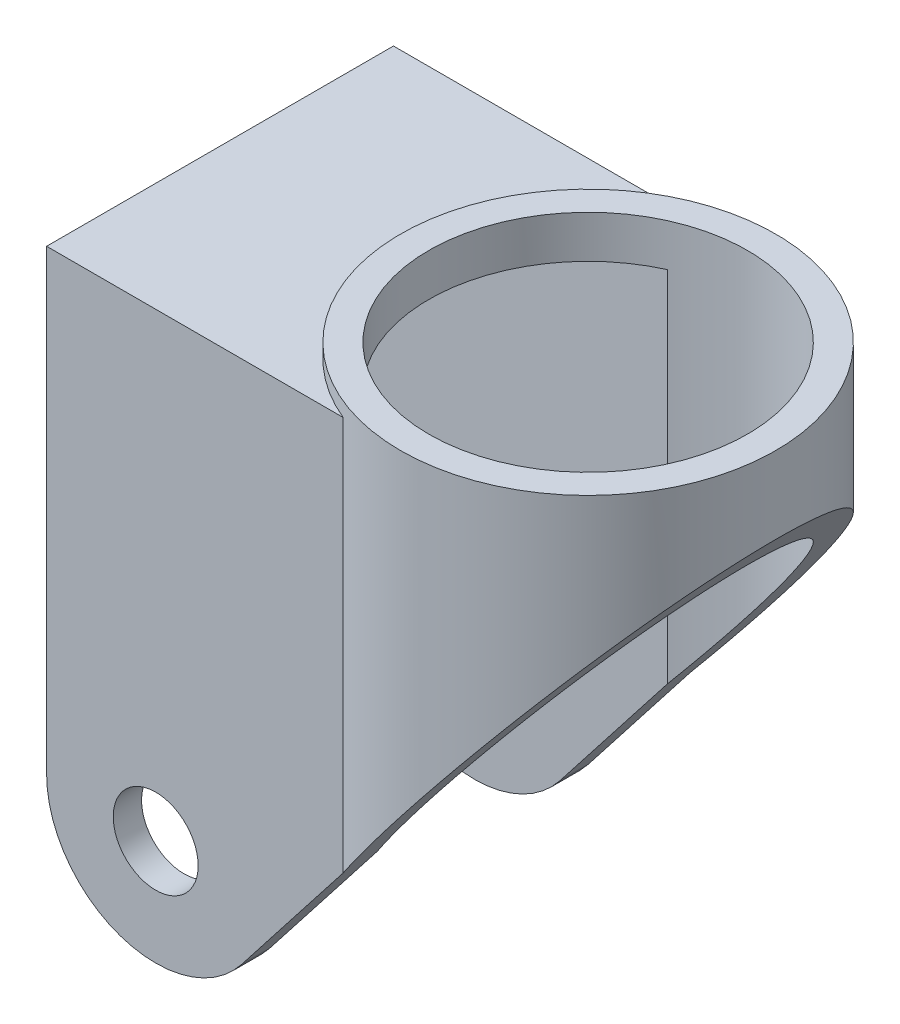
ISO-10303-21;
HEADER;
FILE_DESCRIPTION(('STEP AP214'),'2;1');
FILE_NAME('part.step','',(''),(''),'','','');
FILE_SCHEMA(('AUTOMOTIVE_DESIGN { 1 0 10303 214 1 1 1 1 }'));
ENDSEC;
DATA;
#1=APPLICATION_CONTEXT('core data for automotive mechanical design processes');
#2=APPLICATION_PROTOCOL_DEFINITION('international standard','automotive_design',2000,#1);
#3=PRODUCT_CONTEXT('',#1,'mechanical');
#4=PRODUCT('Part','Part','',(#3));
#5=PRODUCT_RELATED_PRODUCT_CATEGORY('part','',(#4));
#6=PRODUCT_DEFINITION_FORMATION('','',#4);
#7=PRODUCT_DEFINITION_CONTEXT('part definition',#1,'design');
#8=PRODUCT_DEFINITION('design','',#6,#7);
#9=PRODUCT_DEFINITION_SHAPE('','',#8);
#10=(LENGTH_UNIT() NAMED_UNIT(*) SI_UNIT(.MILLI.,.METRE.));
#11=(NAMED_UNIT(*) PLANE_ANGLE_UNIT() SI_UNIT($,.RADIAN.));
#12=(NAMED_UNIT(*) SI_UNIT($,.STERADIAN.) SOLID_ANGLE_UNIT());
#13=UNCERTAINTY_MEASURE_WITH_UNIT(LENGTH_MEASURE(1.E-05),#10,'distance_accuracy_value','');
#14=(GEOMETRIC_REPRESENTATION_CONTEXT(3) GLOBAL_UNCERTAINTY_ASSIGNED_CONTEXT((#13)) GLOBAL_UNIT_ASSIGNED_CONTEXT((#10,
#11,#12)) REPRESENTATION_CONTEXT('',''));
#15=CARTESIAN_POINT('',(0.,0.,0.));
#16=DIRECTION('',(0.,0.,1.));
#17=DIRECTION('',(1.,0.,0.));
#18=AXIS2_PLACEMENT_3D('',#15,#16,#17);
#19=CARTESIAN_POINT('',(-36.5900385910955,15.4099614089045,20.5));
#20=DIRECTION('',(0.,0.,1.));
#21=DIRECTION('',(1.,0.,0.));
#22=AXIS2_PLACEMENT_3D('',#19,#20,#21);
#23=CYLINDRICAL_SURFACE('',#22,15.4099614089045);
#24=DIRECTION('',(0.,0.,1.));
#25=VECTOR('',#24,1.);
#26=CARTESIAN_POINT('',(-52.,15.4099614089045,24.5));
#27=LINE('',#26,#25);
#28=CARTESIAN_POINT('',(-52.,15.4099614089045,20.5));
#29=VERTEX_POINT('',#28);
#30=CARTESIAN_POINT('',(-52.,15.4099614089045,24.5));
#31=VERTEX_POINT('',#30);
#32=EDGE_CURVE('E206',#29,#31,#27,.T.);
#33=ORIENTED_EDGE('',*,*,#32,.F.);
#34=CARTESIAN_POINT('',(-36.5900385910955,15.4099614089045,20.4999999999968));
#35=DIRECTION('',(-2.10034980860577E-13,0.,-1.));
#36=DIRECTION('',(-1.,0.,2.10034980860577E-13));
#37=AXIS2_PLACEMENT_3D('',#34,#35,#36);
#38=CIRCLE('',#37,15.4099614089045);
#39=CARTESIAN_POINT('',(-24.4468232882142,5.92264183318687,20.4999999999942));
#40=VERTEX_POINT('',#39);
#41=EDGE_CURVE('E53',#40,#29,#38,.T.);
#42=ORIENTED_EDGE('',*,*,#41,.F.);
#43=DIRECTION('',(0.,0.,-1.));
#44=VECTOR('',#43,1.);
#45=CARTESIAN_POINT('',(-24.4468232882142,5.92264183318687,20.5));
#46=LINE('',#45,#44);
#47=CARTESIAN_POINT('',(-24.4468232882142,5.92264183318687,24.4999999999942));
#48=VERTEX_POINT('',#47);
#49=EDGE_CURVE('E209',#48,#40,#46,.T.);
#50=ORIENTED_EDGE('',*,*,#49,.F.);
#51=CARTESIAN_POINT('',(-36.5900385910955,15.4099614089045,24.4999999999968));
#52=DIRECTION('',(-2.10034980860577E-13,0.,-1.));
#53=DIRECTION('',(-1.,0.,2.10034980860577E-13));
#54=AXIS2_PLACEMENT_3D('',#51,#52,#53);
#55=CIRCLE('',#54,15.4099614089045);
#56=EDGE_CURVE('E12',#31,#48,#55,.F.);
#57=ORIENTED_EDGE('',*,*,#56,.F.);
#58=EDGE_LOOP('',(#33,#42,#50,#57));
#59=FACE_BOUND('',#58,.T.);
#60=ADVANCED_FACE('F44',(#59),#23,.T.);
#61=CARTESIAN_POINT('',(-36.5900385910955,15.4099614089045,-20.5000000000109));
#62=DIRECTION('',(0.,0.,-1.));
#63=DIRECTION('',(-1.,0.,0.));
#64=AXIS2_PLACEMENT_3D('',#61,#62,#63);
#65=CYLINDRICAL_SURFACE('',#64,15.4099614089045);
#66=DIRECTION('',(0.,0.,1.));
#67=VECTOR('',#66,1.);
#68=CARTESIAN_POINT('',(-24.4468232882142,5.92264183318688,-20.5000000000109));
#69=LINE('',#68,#67);
#70=CARTESIAN_POINT('',(-24.4468232882142,5.92264183318687,-20.5000000000109));
#71=VERTEX_POINT('',#70);
#72=CARTESIAN_POINT('',(-24.4468232882142,5.92264183318687,-24.5000000000109));
#73=VERTEX_POINT('',#72);
#74=EDGE_CURVE('E130',#71,#73,#69,.F.);
#75=ORIENTED_EDGE('',*,*,#74,.F.);
#76=CARTESIAN_POINT('',(-36.5900385910955,15.4099614089045,-20.5000000000109));
#77=DIRECTION('',(0.,0.,1.));
#78=DIRECTION('',(1.,0.,0.));
#79=AXIS2_PLACEMENT_3D('',#76,#77,#78);
#80=CIRCLE('',#79,15.4099614089045);
#81=CARTESIAN_POINT('',(-52.,15.4099614089045,-20.5000000000109));
#82=VERTEX_POINT('',#81);
#83=EDGE_CURVE('E202',#82,#71,#80,.T.);
#84=ORIENTED_EDGE('',*,*,#83,.F.);
#85=DIRECTION('',(0.,0.,-1.));
#86=VECTOR('',#85,1.);
#87=CARTESIAN_POINT('',(-52.,15.4099614089045,24.5));
#88=LINE('',#87,#86);
#89=CARTESIAN_POINT('',(-52.,15.4099614089045,-24.5000000000109));
#90=VERTEX_POINT('',#89);
#91=EDGE_CURVE('E199',#90,#82,#88,.F.);
#92=ORIENTED_EDGE('',*,*,#91,.F.);
#93=CARTESIAN_POINT('',(-36.5900385910955,15.4099614089045,-24.5000000000109));
#94=DIRECTION('',(0.,0.,1.));
#95=DIRECTION('',(1.,0.,0.));
#96=AXIS2_PLACEMENT_3D('',#93,#94,#95);
#97=CIRCLE('',#96,15.4099614089045);
#98=EDGE_CURVE('E204',#73,#90,#97,.F.);
#99=ORIENTED_EDGE('',*,*,#98,.F.);
#100=EDGE_LOOP('',(#75,#84,#92,#99));
#101=FACE_BOUND('',#100,.T.);
#102=ADVANCED_FACE('F238',(#101),#65,.T.);
#103=CARTESIAN_POINT('',(0.,82.,0.));
#104=DIRECTION('',(0.,-1.,0.));
#105=DIRECTION('',(0.,0.,-1.));
#106=AXIS2_PLACEMENT_3D('',#103,#104,#105);
#107=CYLINDRICAL_SURFACE('',#106,22.5);
#108=DIRECTION('',(0.,-1.,0.));
#109=VECTOR('',#108,1.);
#110=CARTESIAN_POINT('',(-9.2736184954716,76.,-20.5000000000109));
#111=LINE('',#110,#109);
#112=CARTESIAN_POINT('',(-9.2736184954716,76.,-20.5000000000109));
#113=VERTEX_POINT('',#112);
#114=CARTESIAN_POINT('',(-9.2736184954716,25.3434583412096,-20.5000000000109));
#115=VERTEX_POINT('',#114);
#116=EDGE_CURVE('E147',#113,#115,#111,.T.);
#117=ORIENTED_EDGE('',*,*,#116,.T.);
#118=CARTESIAN_POINT('',(0.,37.2131487346395,0.));
#119=DIRECTION('',(0.788010753606721,-0.615661475325659,0.));
#120=DIRECTION('',(-0.615661475325659,-0.788010753606721,0.));
#121=AXIS2_PLACEMENT_3D('',#118,#119,#120);
#122=ELLIPSE('',#121,36.5460580233617,22.5);
#123=CARTESIAN_POINT('',(-9.27361849551552,25.3434583411534,20.499999999991));
#124=VERTEX_POINT('',#123);
#125=EDGE_CURVE('E146',#115,#124,#122,.T.);
#126=ORIENTED_EDGE('',*,*,#125,.T.);
#127=DIRECTION('',(0.,-1.,0.));
#128=VECTOR('',#127,1.);
#129=CARTESIAN_POINT('',(-9.27361849551552,25.3434583411534,20.499999999991));
#130=LINE('',#129,#128);
#131=CARTESIAN_POINT('',(-9.27361849551553,76.,20.499999999991));
#132=VERTEX_POINT('',#131);
#133=EDGE_CURVE('E137',#124,#132,#130,.F.);
#134=ORIENTED_EDGE('',*,*,#133,.T.);
#135=CARTESIAN_POINT('',(0.,76.,0.));
#136=DIRECTION('',(0.,-1.,0.));
#137=DIRECTION('',(0.,0.,-1.));
#138=AXIS2_PLACEMENT_3D('',#135,#136,#137);
#139=CIRCLE('',#138,22.5);
#140=EDGE_CURVE('E119',#132,#113,#139,.T.);
#141=ORIENTED_EDGE('',*,*,#140,.T.);
#142=EDGE_LOOP('',(#117,#126,#134,#141));
#143=FACE_BOUND('',#142,.T.);
#144=CARTESIAN_POINT('',(0.,82.,0.));
#145=DIRECTION('',(0.,1.,0.));
#146=DIRECTION('',(0.,0.,1.));
#147=AXIS2_PLACEMENT_3D('',#144,#145,#146);
#148=CIRCLE('',#147,22.5);
#149=CARTESIAN_POINT('',(0.,82.,22.5));
#150=VERTEX_POINT('',#149);
#151=EDGE_CURVE('E189',#150,#150,#148,.T.);
#152=ORIENTED_EDGE('',*,*,#151,.T.);
#153=EDGE_LOOP('',(#152));
#154=FACE_BOUND('',#153,.T.);
#155=ADVANCED_FACE('F143',(#143,#154),#107,.F.);
#156=CARTESIAN_POINT('',(0.,82.,0.));
#157=DIRECTION('',(0.,-1.,0.));
#158=DIRECTION('',(0.,0.,-1.));
#159=AXIS2_PLACEMENT_3D('',#156,#157,#158);
#160=CYLINDRICAL_SURFACE('',#159,26.5);
#161=CARTESIAN_POINT('',(0.,82.,0.));
#162=DIRECTION('',(0.,1.,0.));
#163=DIRECTION('',(0.,0.,1.));
#164=AXIS2_PLACEMENT_3D('',#161,#162,#163);
#165=CIRCLE('',#164,26.5);
#166=CARTESIAN_POINT('',(0.,82.,26.5));
#167=VERTEX_POINT('',#166);
#168=EDGE_CURVE('E192',#167,#167,#165,.T.);
#169=ORIENTED_EDGE('',*,*,#168,.F.);
#170=EDGE_LOOP('',(#169));
#171=FACE_BOUND('',#170,.T.);
#172=CARTESIAN_POINT('',(0.,37.2131487346395,0.));
#173=DIRECTION('',(0.788010753606721,-0.615661475325659,0.));
#174=DIRECTION('',(-0.615661475325659,-0.788010753606721,0.));
#175=AXIS2_PLACEMENT_3D('',#172,#173,#174);
#176=ELLIPSE('',#175,43.0431350052927,26.5);
#177=CARTESIAN_POINT('',(-10.0995049383356,24.2863718995241,-24.5000000000109));
#178=VERTEX_POINT('',#177);
#179=CARTESIAN_POINT('',(-10.0995049383834,24.286371899463,24.4999999999912));
#180=VERTEX_POINT('',#179);
#181=EDGE_CURVE('E166',#178,#180,#176,.T.);
#182=ORIENTED_EDGE('',*,*,#181,.F.);
#183=DIRECTION('',(0.,-1.,0.));
#184=VECTOR('',#183,1.);
#185=CARTESIAN_POINT('',(-10.0995049383356,82.,-24.5000000000109));
#186=LINE('',#185,#184);
#187=CARTESIAN_POINT('',(-10.0995049383356,80.,-24.5000000000109));
#188=VERTEX_POINT('',#187);
#189=EDGE_CURVE('E186',#188,#178,#186,.T.);
#190=ORIENTED_EDGE('',*,*,#189,.F.);
#191=CARTESIAN_POINT('',(0.,80.,0.));
#192=DIRECTION('',(0.,-1.,0.));
#193=DIRECTION('',(0.,0.,-1.));
#194=AXIS2_PLACEMENT_3D('',#191,#192,#193);
#195=CIRCLE('',#194,26.5);
#196=CARTESIAN_POINT('',(-10.0995049383834,80.,24.4999999999912));
#197=VERTEX_POINT('',#196);
#198=EDGE_CURVE('E131',#197,#188,#195,.T.);
#199=ORIENTED_EDGE('',*,*,#198,.F.);
#200=DIRECTION('',(0.,-1.,0.));
#201=VECTOR('',#200,1.);
#202=CARTESIAN_POINT('',(-10.0995049383834,82.,24.4999999999912));
#203=LINE('',#202,#201);
#204=EDGE_CURVE('E184',#180,#197,#203,.F.);
#205=ORIENTED_EDGE('',*,*,#204,.F.);
#206=EDGE_LOOP('',(#182,#190,#199,#205));
#207=FACE_BOUND('',#206,.T.);
#208=ADVANCED_FACE('F228',(#171,#207),#160,.T.);
#209=CARTESIAN_POINT('',(0.,80.,24.4999999999891));
#210=DIRECTION('',(-2.10034980860577E-13,0.,-1.));
#211=DIRECTION('',(-1.,0.,2.10034980860577E-13));
#212=AXIS2_PLACEMENT_3D('',#209,#210,#211);
#213=PLANE('',#212);
#214=CARTESIAN_POINT('',(-36.5900385910954,14.9244773027306,24.4999999999891));
#215=DIRECTION('',(0.,0.,1.));
#216=DIRECTION('',(1.,0.,0.));
#217=AXIS2_PLACEMENT_3D('',#214,#215,#216);
#218=CIRCLE('',#217,5.99999999999999);
#219=CARTESIAN_POINT('',(-30.5900385910954,14.9244773027306,24.4999999999891));
#220=VERTEX_POINT('',#219);
#221=EDGE_CURVE('E293',#220,#220,#218,.T.);
#222=ORIENTED_EDGE('',*,*,#221,.F.);
#223=EDGE_LOOP('',(#222));
#224=FACE_BOUND('',#223,.T.);
#225=DIRECTION('',(0.,-1.,0.));
#226=VECTOR('',#225,1.);
#227=CARTESIAN_POINT('',(-52.,80.,24.5));
#228=LINE('',#227,#226);
#229=CARTESIAN_POINT('',(-52.,80.,24.5));
#230=VERTEX_POINT('',#229);
#231=EDGE_CURVE('E179',#230,#31,#228,.T.);
#232=ORIENTED_EDGE('',*,*,#231,.T.);
#233=ORIENTED_EDGE('',*,*,#56,.T.);
#234=DIRECTION('',(-0.615661475325659,-0.788010753606721,1.29310446186619E-13));
#235=VECTOR('',#234,1.);
#236=CARTESIAN_POINT('',(20.757949461793,63.7821124497482,24.4999999999847));
#237=LINE('',#236,#235);
#238=EDGE_CURVE('E169',#180,#48,#237,.T.);
#239=ORIENTED_EDGE('',*,*,#238,.F.);
#240=ORIENTED_EDGE('',*,*,#204,.T.);
#241=DIRECTION('',(1.,0.,-2.10034980860576E-13));
#242=VECTOR('',#241,1.);
#243=CARTESIAN_POINT('',(0.,80.,24.4999999999891));
#244=LINE('',#243,#242);
#245=EDGE_CURVE('E176',#230,#197,#244,.T.);
#246=ORIENTED_EDGE('',*,*,#245,.F.);
#247=EDGE_LOOP('',(#232,#233,#239,#240,#246));
#248=FACE_BOUND('',#247,.T.);
#249=ADVANCED_FACE('F224',(#224,#248),#213,.F.);
#250=CARTESIAN_POINT('',(-52.,80.,-24.5000000000109));
#251=DIRECTION('',(0.,0.,1.));
#252=DIRECTION('',(1.,0.,0.));
#253=AXIS2_PLACEMENT_3D('',#250,#251,#252);
#254=PLANE('',#253);
#255=CARTESIAN_POINT('',(-36.5900385910954,14.9244773027306,-24.5000000000109));
#256=DIRECTION('',(0.,0.,1.));
#257=DIRECTION('',(1.,0.,0.));
#258=AXIS2_PLACEMENT_3D('',#255,#256,#257);
#259=CIRCLE('',#258,5.99999999999999);
#260=CARTESIAN_POINT('',(-30.5900385910954,14.9244773027306,-24.5000000000109));
#261=VERTEX_POINT('',#260);
#262=EDGE_CURVE('E162',#261,#261,#259,.T.);
#263=ORIENTED_EDGE('',*,*,#262,.T.);
#264=EDGE_LOOP('',(#263));
#265=FACE_BOUND('',#264,.T.);
#266=DIRECTION('',(0.615661475325659,0.788010753606721,0.));
#267=VECTOR('',#266,1.);
#268=CARTESIAN_POINT('',(1.04791874738434,38.5544235665723,-24.5000000000109));
#269=LINE('',#268,#267);
#270=EDGE_CURVE('E164',#73,#178,#269,.T.);
#271=ORIENTED_EDGE('',*,*,#270,.F.);
#272=ORIENTED_EDGE('',*,*,#98,.T.);
#273=DIRECTION('',(0.,-1.,0.));
#274=VECTOR('',#273,1.);
#275=CARTESIAN_POINT('',(-52.,80.,-24.5000000000109));
#276=LINE('',#275,#274);
#277=CARTESIAN_POINT('',(-52.,80.,-24.5000000000109));
#278=VERTEX_POINT('',#277);
#279=EDGE_CURVE('E181',#278,#90,#276,.T.);
#280=ORIENTED_EDGE('',*,*,#279,.F.);
#281=DIRECTION('',(-1.,0.,0.));
#282=VECTOR('',#281,1.);
#283=CARTESIAN_POINT('',(-52.,80.,-24.5000000000109));
#284=LINE('',#283,#282);
#285=EDGE_CURVE('E172',#188,#278,#284,.T.);
#286=ORIENTED_EDGE('',*,*,#285,.F.);
#287=ORIENTED_EDGE('',*,*,#189,.T.);
#288=EDGE_LOOP('',(#271,#272,#280,#286,#287));
#289=FACE_BOUND('',#288,.T.);
#290=ADVANCED_FACE('F236',(#265,#289),#254,.F.);
#291=CARTESIAN_POINT('',(0.,82.,0.));
#292=DIRECTION('',(0.,1.,0.));
#293=DIRECTION('',(0.,0.,1.));
#294=AXIS2_PLACEMENT_3D('',#291,#292,#293);
#295=PLANE('',#294);
#296=ORIENTED_EDGE('',*,*,#151,.F.);
#297=EDGE_LOOP('',(#296));
#298=FACE_BOUND('',#297,.T.);
#299=ORIENTED_EDGE('',*,*,#168,.T.);
#300=EDGE_LOOP('',(#299));
#301=FACE_BOUND('',#300,.T.);
#302=ADVANCED_FACE('F252',(#298,#301),#295,.T.);
#303=CARTESIAN_POINT('',(0.,80.,0.));
#304=DIRECTION('',(0.,-1.,0.));
#305=DIRECTION('',(0.,0.,-1.));
#306=AXIS2_PLACEMENT_3D('',#303,#304,#305);
#307=PLANE('',#306);
#308=ORIENTED_EDGE('',*,*,#245,.T.);
#309=ORIENTED_EDGE('',*,*,#198,.T.);
#310=ORIENTED_EDGE('',*,*,#285,.T.);
#311=DIRECTION('',(0.,0.,1.));
#312=VECTOR('',#311,1.);
#313=CARTESIAN_POINT('',(-52.,80.,24.5));
#314=LINE('',#313,#312);
#315=EDGE_CURVE('E174',#278,#230,#314,.T.);
#316=ORIENTED_EDGE('',*,*,#315,.T.);
#317=EDGE_LOOP('',(#308,#309,#310,#316));
#318=FACE_BOUND('',#317,.T.);
#319=ADVANCED_FACE('F231',(#318),#307,.F.);
#320=CARTESIAN_POINT('',(-52.,80.,24.5));
#321=DIRECTION('',(1.,0.,0.));
#322=DIRECTION('',(0.,0.,-1.));
#323=AXIS2_PLACEMENT_3D('',#320,#321,#322);
#324=PLANE('',#323);
#325=DIRECTION('',(0.,-1.,0.));
#326=VECTOR('',#325,1.);
#327=CARTESIAN_POINT('',(-52.,80.,20.5));
#328=LINE('',#327,#326);
#329=CARTESIAN_POINT('',(-52.,76.,20.5));
#330=VERTEX_POINT('',#329);
#331=EDGE_CURVE('E140',#330,#29,#328,.T.);
#332=ORIENTED_EDGE('',*,*,#331,.T.);
#333=ORIENTED_EDGE('',*,*,#32,.T.);
#334=ORIENTED_EDGE('',*,*,#231,.F.);
#335=ORIENTED_EDGE('',*,*,#315,.F.);
#336=ORIENTED_EDGE('',*,*,#279,.T.);
#337=ORIENTED_EDGE('',*,*,#91,.T.);
#338=DIRECTION('',(0.,-1.,0.));
#339=VECTOR('',#338,1.);
#340=CARTESIAN_POINT('',(-52.,80.,-20.5000000000109));
#341=LINE('',#340,#339);
#342=CARTESIAN_POINT('',(-52.,76.,-20.5000000000109));
#343=VERTEX_POINT('',#342);
#344=EDGE_CURVE('E148',#343,#82,#341,.T.);
#345=ORIENTED_EDGE('',*,*,#344,.F.);
#346=DIRECTION('',(0.,0.,1.));
#347=VECTOR('',#346,1.);
#348=CARTESIAN_POINT('',(-52.,76.,0.));
#349=LINE('',#348,#347);
#350=EDGE_CURVE('E141',#343,#330,#349,.T.);
#351=ORIENTED_EDGE('',*,*,#350,.T.);
#352=EDGE_LOOP('',(#332,#333,#334,#335,#336,#337,#345,#351));
#353=FACE_BOUND('',#352,.T.);
#354=ADVANCED_FACE('F213',(#353),#324,.F.);
#355=CARTESIAN_POINT('',(26.5,71.131601987756,184.725856080036));
#356=DIRECTION('',(0.788010753606721,-0.615661475325659,0.));
#357=DIRECTION('',(0.615661475325659,0.788010753606721,0.));
#358=AXIS2_PLACEMENT_3D('',#355,#356,#357);
#359=PLANE('',#358);
#360=ORIENTED_EDGE('',*,*,#238,.T.);
#361=ORIENTED_EDGE('',*,*,#49,.T.);
#362=DIRECTION('',(-0.615661475325659,-0.788010753606721,1.29310446186619E-13));
#363=VECTOR('',#362,1.);
#364=CARTESIAN_POINT('',(20.7579494617927,63.7821124497478,20.4999999999847));
#365=LINE('',#364,#363);
#366=EDGE_CURVE('E156',#124,#40,#365,.T.);
#367=ORIENTED_EDGE('',*,*,#366,.F.);
#368=ORIENTED_EDGE('',*,*,#125,.F.);
#369=DIRECTION('',(0.615661475325659,0.788010753606721,0.));
#370=VECTOR('',#369,1.);
#371=CARTESIAN_POINT('',(1.04791874738434,38.5544235665723,-20.5000000000109));
#372=LINE('',#371,#370);
#373=EDGE_CURVE('E158',#71,#115,#372,.T.);
#374=ORIENTED_EDGE('',*,*,#373,.F.);
#375=ORIENTED_EDGE('',*,*,#74,.T.);
#376=ORIENTED_EDGE('',*,*,#270,.T.);
#377=ORIENTED_EDGE('',*,*,#181,.T.);
#378=EDGE_LOOP('',(#360,#361,#367,#368,#374,#375,#376,#377));
#379=FACE_BOUND('',#378,.T.);
#380=ADVANCED_FACE('F221',(#379),#359,.T.);
#381=CARTESIAN_POINT('',(-8.40139923442306E-13,80.,20.4999999999891));
#382=DIRECTION('',(-2.10034980860577E-13,0.,-1.));
#383=DIRECTION('',(-1.,0.,2.10034980860577E-13));
#384=AXIS2_PLACEMENT_3D('',#381,#382,#383);
#385=PLANE('',#384);
#386=CARTESIAN_POINT('',(-36.5900385910954,14.9244773027306,20.4999999999968));
#387=DIRECTION('',(-2.10034980860577E-13,0.,-1.));
#388=DIRECTION('',(-1.,0.,2.10034980860577E-13));
#389=AXIS2_PLACEMENT_3D('',#386,#387,#388);
#390=CIRCLE('',#389,5.99999999999999);
#391=CARTESIAN_POINT('',(-42.5900385910954,14.9244773027306,20.499999999998));
#392=VERTEX_POINT('',#391);
#393=EDGE_CURVE('E289',#392,#392,#390,.T.);
#394=ORIENTED_EDGE('',*,*,#393,.F.);
#395=EDGE_LOOP('',(#394));
#396=FACE_BOUND('',#395,.T.);
#397=ORIENTED_EDGE('',*,*,#366,.T.);
#398=ORIENTED_EDGE('',*,*,#41,.T.);
#399=ORIENTED_EDGE('',*,*,#331,.F.);
#400=DIRECTION('',(1.,0.,-2.10034980860577E-13));
#401=VECTOR('',#400,1.);
#402=CARTESIAN_POINT('',(4.30571710763953E-12,76.,20.4999999999891));
#403=LINE('',#402,#401);
#404=EDGE_CURVE('E123',#330,#132,#403,.T.);
#405=ORIENTED_EDGE('',*,*,#404,.T.);
#406=ORIENTED_EDGE('',*,*,#133,.F.);
#407=EDGE_LOOP('',(#397,#398,#399,#405,#406));
#408=FACE_BOUND('',#407,.T.);
#409=ADVANCED_FACE('F136',(#396,#408),#385,.T.);
#410=CARTESIAN_POINT('',(-52.,80.,-20.5000000000109));
#411=DIRECTION('',(0.,0.,1.));
#412=DIRECTION('',(1.,0.,0.));
#413=AXIS2_PLACEMENT_3D('',#410,#411,#412);
#414=PLANE('',#413);
#415=CARTESIAN_POINT('',(-36.5900385910954,14.9244773027306,-20.5000000000109));
#416=DIRECTION('',(0.,0.,1.));
#417=DIRECTION('',(1.,0.,0.));
#418=AXIS2_PLACEMENT_3D('',#415,#416,#417);
#419=CIRCLE('',#418,5.99999999999999);
#420=CARTESIAN_POINT('',(-30.5900385910954,14.9244773027306,-20.5000000000109));
#421=VERTEX_POINT('',#420);
#422=EDGE_CURVE('E48',#421,#421,#419,.T.);
#423=ORIENTED_EDGE('',*,*,#422,.F.);
#424=EDGE_LOOP('',(#423));
#425=FACE_BOUND('',#424,.T.);
#426=ORIENTED_EDGE('',*,*,#344,.T.);
#427=ORIENTED_EDGE('',*,*,#83,.T.);
#428=ORIENTED_EDGE('',*,*,#373,.T.);
#429=ORIENTED_EDGE('',*,*,#116,.F.);
#430=DIRECTION('',(-1.,0.,0.));
#431=VECTOR('',#430,1.);
#432=CARTESIAN_POINT('',(0.,76.,-20.5000000000109));
#433=LINE('',#432,#431);
#434=EDGE_CURVE('E125',#113,#343,#433,.T.);
#435=ORIENTED_EDGE('',*,*,#434,.T.);
#436=EDGE_LOOP('',(#426,#427,#428,#429,#435));
#437=FACE_BOUND('',#436,.T.);
#438=ADVANCED_FACE('F217',(#425,#437),#414,.T.);
#439=CARTESIAN_POINT('',(0.,76.,0.));
#440=DIRECTION('',(0.,-1.,0.));
#441=DIRECTION('',(0.,0.,-1.));
#442=AXIS2_PLACEMENT_3D('',#439,#440,#441);
#443=PLANE('',#442);
#444=ORIENTED_EDGE('',*,*,#140,.F.);
#445=ORIENTED_EDGE('',*,*,#404,.F.);
#446=ORIENTED_EDGE('',*,*,#350,.F.);
#447=ORIENTED_EDGE('',*,*,#434,.F.);
#448=EDGE_LOOP('',(#444,#445,#446,#447));
#449=FACE_BOUND('',#448,.T.);
#450=ADVANCED_FACE('F121',(#449),#443,.T.);
#451=CARTESIAN_POINT('',(-36.5900385910954,14.9244773027306,-55.5000000000109));
#452=DIRECTION('',(0.,0.,1.));
#453=DIRECTION('',(1.,0.,0.));
#454=AXIS2_PLACEMENT_3D('',#451,#452,#453);
#455=CYLINDRICAL_SURFACE('',#454,5.99999999999999);
#456=ORIENTED_EDGE('',*,*,#422,.T.);
#457=EDGE_LOOP('',(#456));
#458=FACE_BOUND('',#457,.T.);
#459=ORIENTED_EDGE('',*,*,#262,.F.);
#460=EDGE_LOOP('',(#459));
#461=FACE_BOUND('',#460,.T.);
#462=ADVANCED_FACE('F270',(#458,#461),#455,.F.);
#463=ORIENTED_EDGE('',*,*,#393,.T.);
#464=EDGE_LOOP('',(#463));
#465=FACE_BOUND('',#464,.T.);
#466=ORIENTED_EDGE('',*,*,#221,.T.);
#467=EDGE_LOOP('',(#466));
#468=FACE_BOUND('',#467,.T.);
#469=ADVANCED_FACE('F278',(#465,#468),#455,.F.);
#470=CLOSED_SHELL('',(#60,#102,#155,#208,#249,#290,#302,#319,#354,#380,#409,#438,#450,#462,#469));
#471=MANIFOLD_SOLID_BREP('B2',#470);
#472=ADVANCED_BREP_SHAPE_REPRESENTATION('',(#18,#471),#14);
#473=SHAPE_DEFINITION_REPRESENTATION(#9,#472);
ENDSEC;
END-ISO-10303-21;
